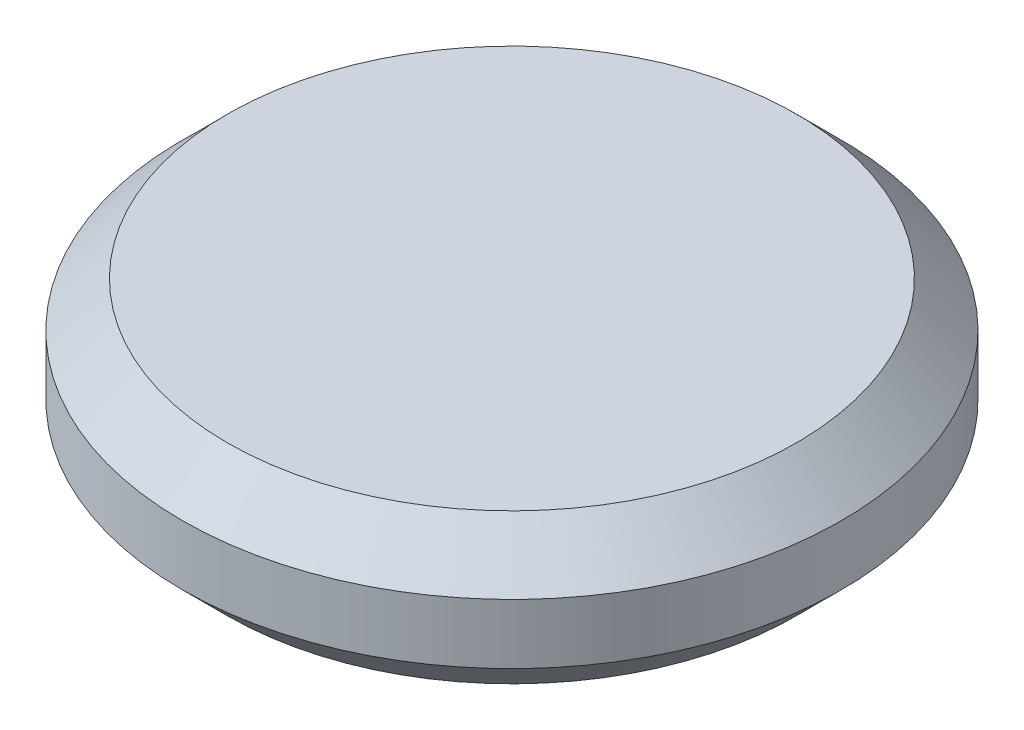
ISO-10303-21;
HEADER;
FILE_DESCRIPTION(('STEP AP214'),'2;1');
FILE_NAME('part.step','',(''),(''),'','','');
FILE_SCHEMA(('AUTOMOTIVE_DESIGN { 1 0 10303 214 1 1 1 1 }'));
ENDSEC;
DATA;
#1=APPLICATION_CONTEXT('core data for automotive mechanical design processes');
#2=APPLICATION_PROTOCOL_DEFINITION('international standard','automotive_design',2000,#1);
#3=PRODUCT_CONTEXT('',#1,'mechanical');
#4=PRODUCT('Part','Part','',(#3));
#5=PRODUCT_RELATED_PRODUCT_CATEGORY('part','',(#4));
#6=PRODUCT_DEFINITION_FORMATION('','',#4);
#7=PRODUCT_DEFINITION_CONTEXT('part definition',#1,'design');
#8=PRODUCT_DEFINITION('design','',#6,#7);
#9=PRODUCT_DEFINITION_SHAPE('','',#8);
#10=(LENGTH_UNIT() NAMED_UNIT(*) SI_UNIT(.MILLI.,.METRE.));
#11=(NAMED_UNIT(*) PLANE_ANGLE_UNIT() SI_UNIT($,.RADIAN.));
#12=(NAMED_UNIT(*) SI_UNIT($,.STERADIAN.) SOLID_ANGLE_UNIT());
#13=UNCERTAINTY_MEASURE_WITH_UNIT(LENGTH_MEASURE(1.E-05),#10,'distance_accuracy_value','');
#14=(GEOMETRIC_REPRESENTATION_CONTEXT(3) GLOBAL_UNCERTAINTY_ASSIGNED_CONTEXT((#13)) GLOBAL_UNIT_ASSIGNED_CONTEXT((#10,
#11,#12)) REPRESENTATION_CONTEXT('',''));
#15=CARTESIAN_POINT('',(0.,0.,0.));
#16=DIRECTION('',(0.,0.,1.));
#17=DIRECTION('',(1.,0.,0.));
#18=AXIS2_PLACEMENT_3D('',#15,#16,#17);
#19=CARTESIAN_POINT('',(0.,16.6666666666667,0.));
#20=DIRECTION('',(0.,-1.,0.));
#21=DIRECTION('',(0.,0.,-1.));
#22=AXIS2_PLACEMENT_3D('',#19,#20,#21);
#23=CYLINDRICAL_SURFACE('',#22,36.6666666666667);
#24=CARTESIAN_POINT('',(0.,5.00000000000003,0.));
#25=DIRECTION('',(0.,1.,0.));
#26=DIRECTION('',(0.,0.,1.));
#27=AXIS2_PLACEMENT_3D('',#24,#25,#26);
#28=CIRCLE('',#27,36.6666666666667);
#29=CARTESIAN_POINT('',(0.,5.00000000000003,36.6666666666667));
#30=VERTEX_POINT('',#29);
#31=EDGE_CURVE('E43',#30,#30,#28,.T.);
#32=ORIENTED_EDGE('',*,*,#31,.T.);
#33=EDGE_LOOP('',(#32));
#34=FACE_BOUND('',#33,.T.);
#35=CARTESIAN_POINT('',(0.,11.6666666666667,0.));
#36=DIRECTION('',(0.,1.,0.));
#37=DIRECTION('',(0.,0.,1.));
#38=AXIS2_PLACEMENT_3D('',#35,#36,#37);
#39=CIRCLE('',#38,36.6666666666667);
#40=CARTESIAN_POINT('',(0.,11.6666666666667,36.6666666666667));
#41=VERTEX_POINT('',#40);
#42=EDGE_CURVE('E47',#41,#41,#39,.F.);
#43=ORIENTED_EDGE('',*,*,#42,.T.);
#44=EDGE_LOOP('',(#43));
#45=FACE_BOUND('',#44,.T.);
#46=ADVANCED_FACE('F32',(#34,#45),#23,.T.);
#47=CARTESIAN_POINT('',(0.,16.6666666666667,0.));
#48=DIRECTION('',(0.,1.,0.));
#49=DIRECTION('',(0.,0.,1.));
#50=AXIS2_PLACEMENT_3D('',#47,#48,#49);
#51=PLANE('',#50);
#52=CARTESIAN_POINT('',(0.,16.6666666666667,0.));
#53=DIRECTION('',(0.,1.,0.));
#54=DIRECTION('',(0.,0.,1.));
#55=AXIS2_PLACEMENT_3D('',#52,#53,#54);
#56=CIRCLE('',#55,31.6666666666667);
#57=CARTESIAN_POINT('',(0.,16.6666666666667,31.6666666666667));
#58=VERTEX_POINT('',#57);
#59=EDGE_CURVE('E10',#58,#58,#56,.T.);
#60=ORIENTED_EDGE('',*,*,#59,.T.);
#61=EDGE_LOOP('',(#60));
#62=FACE_BOUND('',#61,.T.);
#63=ADVANCED_FACE('F63',(#62),#51,.T.);
#64=CARTESIAN_POINT('',(0.,0.,0.));
#65=DIRECTION('',(0.,1.,0.));
#66=DIRECTION('',(0.,0.,1.));
#67=AXIS2_PLACEMENT_3D('',#64,#65,#66);
#68=PLANE('',#67);
#69=CARTESIAN_POINT('',(0.,0.,0.));
#70=DIRECTION('',(0.,1.,0.));
#71=DIRECTION('',(0.,0.,1.));
#72=AXIS2_PLACEMENT_3D('',#69,#70,#71);
#73=CIRCLE('',#72,31.6666666666666);
#74=CARTESIAN_POINT('',(0.,0.,31.6666666666666));
#75=VERTEX_POINT('',#74);
#76=EDGE_CURVE('E39',#75,#75,#73,.F.);
#77=ORIENTED_EDGE('',*,*,#76,.T.);
#78=EDGE_LOOP('',(#77));
#79=FACE_BOUND('',#78,.T.);
#80=ADVANCED_FACE('F60',(#79),#68,.F.);
#81=CARTESIAN_POINT('',(0.,5.00000000000003,0.));
#82=DIRECTION('',(0.,1.,0.));
#83=DIRECTION('',(0.,0.,1.));
#84=AXIS2_PLACEMENT_3D('',#81,#82,#83);
#85=CONICAL_SURFACE('',#84,36.6666666666667,0.785398163397448);
#86=ORIENTED_EDGE('',*,*,#76,.F.);
#87=EDGE_LOOP('',(#86));
#88=FACE_BOUND('',#87,.T.);
#89=ORIENTED_EDGE('',*,*,#31,.F.);
#90=EDGE_LOOP('',(#89));
#91=FACE_BOUND('',#90,.T.);
#92=ADVANCED_FACE('F56',(#88,#91),#85,.T.);
#93=CARTESIAN_POINT('',(0.,16.6666666666667,0.));
#94=DIRECTION('',(0.,-1.,0.));
#95=DIRECTION('',(0.,0.,-1.));
#96=AXIS2_PLACEMENT_3D('',#93,#94,#95);
#97=CONICAL_SURFACE('',#96,31.6666666666667,0.785398163397448);
#98=ORIENTED_EDGE('',*,*,#42,.F.);
#99=EDGE_LOOP('',(#98));
#100=FACE_BOUND('',#99,.T.);
#101=ORIENTED_EDGE('',*,*,#59,.F.);
#102=EDGE_LOOP('',(#101));
#103=FACE_BOUND('',#102,.T.);
#104=ADVANCED_FACE('F34',(#100,#103),#97,.T.);
#105=CLOSED_SHELL('',(#46,#63,#80,#92,#104));
#106=MANIFOLD_SOLID_BREP('B2',#105);
#107=ADVANCED_BREP_SHAPE_REPRESENTATION('',(#18,#106),#14);
#108=SHAPE_DEFINITION_REPRESENTATION(#9,#107);
ENDSEC;
END-ISO-10303-21;
